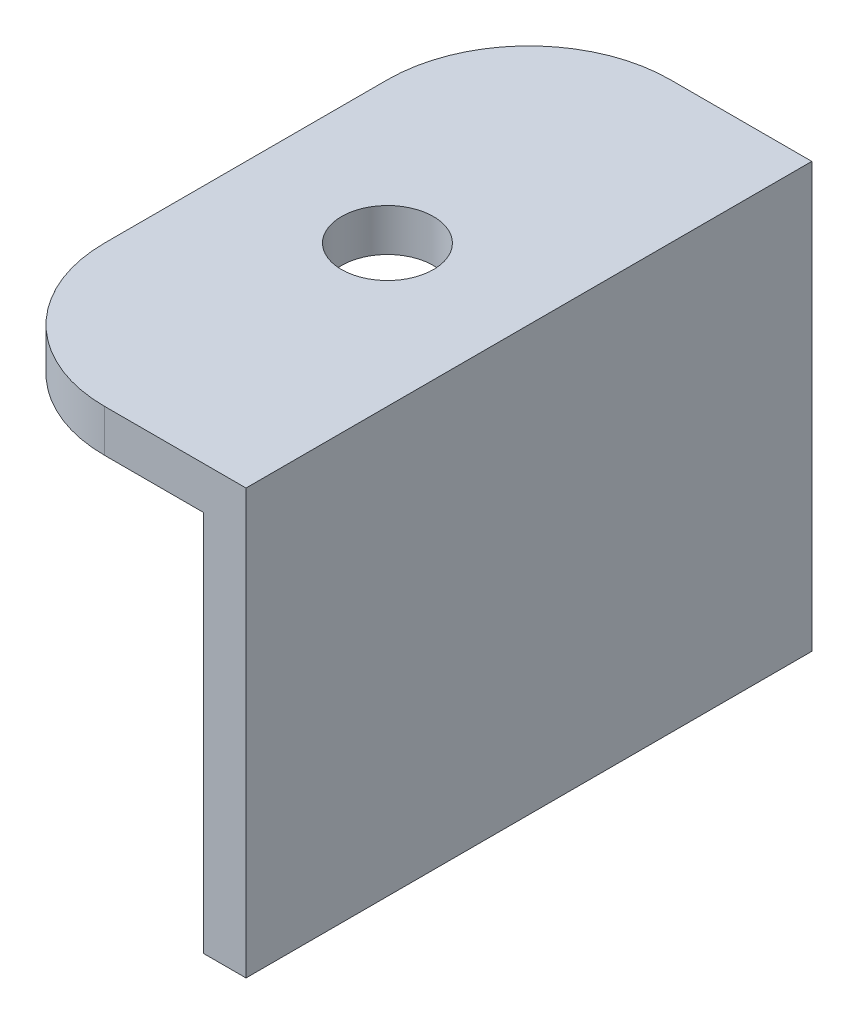
ISO-10303-21;
HEADER;
FILE_DESCRIPTION(('STEP AP214'),'2;1');
FILE_NAME('part.step','',(''),(''),'','','');
FILE_SCHEMA(('AUTOMOTIVE_DESIGN { 1 0 10303 214 1 1 1 1 }'));
ENDSEC;
DATA;
#1=APPLICATION_CONTEXT('core data for automotive mechanical design processes');
#2=APPLICATION_PROTOCOL_DEFINITION('international standard','automotive_design',2000,#1);
#3=PRODUCT_CONTEXT('',#1,'mechanical');
#4=PRODUCT('Part','Part','',(#3));
#5=PRODUCT_RELATED_PRODUCT_CATEGORY('part','',(#4));
#6=PRODUCT_DEFINITION_FORMATION('','',#4);
#7=PRODUCT_DEFINITION_CONTEXT('part definition',#1,'design');
#8=PRODUCT_DEFINITION('design','',#6,#7);
#9=PRODUCT_DEFINITION_SHAPE('','',#8);
#10=(LENGTH_UNIT() NAMED_UNIT(*) SI_UNIT(.MILLI.,.METRE.));
#11=(NAMED_UNIT(*) PLANE_ANGLE_UNIT() SI_UNIT($,.RADIAN.));
#12=(NAMED_UNIT(*) SI_UNIT($,.STERADIAN.) SOLID_ANGLE_UNIT());
#13=UNCERTAINTY_MEASURE_WITH_UNIT(LENGTH_MEASURE(1.E-05),#10,'distance_accuracy_value','');
#14=(GEOMETRIC_REPRESENTATION_CONTEXT(3) GLOBAL_UNCERTAINTY_ASSIGNED_CONTEXT((#13)) GLOBAL_UNIT_ASSIGNED_CONTEXT((#10,
#11,#12)) REPRESENTATION_CONTEXT('',''));
#15=CARTESIAN_POINT('',(0.,0.,0.));
#16=DIRECTION('',(0.,0.,1.));
#17=DIRECTION('',(1.,0.,0.));
#18=AXIS2_PLACEMENT_3D('',#15,#16,#17);
#19=CARTESIAN_POINT('',(-20.,-3.,-20.));
#20=DIRECTION('',(-1.,0.,0.));
#21=DIRECTION('',(0.,0.,1.));
#22=AXIS2_PLACEMENT_3D('',#19,#20,#21);
#23=PLANE('',#22);
#24=DIRECTION('',(0.,0.,1.));
#25=VECTOR('',#24,1.);
#26=CARTESIAN_POINT('',(-20.,0.,-20.));
#27=LINE('',#26,#25);
#28=CARTESIAN_POINT('',(-20.,0.,-10.));
#29=VERTEX_POINT('',#28);
#30=CARTESIAN_POINT('',(-20.,0.,10.));
#31=VERTEX_POINT('',#30);
#32=EDGE_CURVE('E145',#29,#31,#27,.T.);
#33=ORIENTED_EDGE('',*,*,#32,.F.);
#34=DIRECTION('',(0.,-1.,0.));
#35=VECTOR('',#34,1.);
#36=CARTESIAN_POINT('',(-20.,-3.,-10.));
#37=LINE('',#36,#35);
#38=CARTESIAN_POINT('',(-20.,-3.,-10.));
#39=VERTEX_POINT('',#38);
#40=EDGE_CURVE('E159',#29,#39,#37,.T.);
#41=ORIENTED_EDGE('',*,*,#40,.T.);
#42=DIRECTION('',(0.,0.,1.));
#43=VECTOR('',#42,1.);
#44=CARTESIAN_POINT('',(-20.,-3.,-20.));
#45=LINE('',#44,#43);
#46=CARTESIAN_POINT('',(-20.,-3.,10.));
#47=VERTEX_POINT('',#46);
#48=EDGE_CURVE('E121',#39,#47,#45,.T.);
#49=ORIENTED_EDGE('',*,*,#48,.T.);
#50=DIRECTION('',(0.,-1.,0.));
#51=VECTOR('',#50,1.);
#52=CARTESIAN_POINT('',(-20.,0.,10.));
#53=LINE('',#52,#51);
#54=EDGE_CURVE('E147',#47,#31,#53,.F.);
#55=ORIENTED_EDGE('',*,*,#54,.T.);
#56=EDGE_LOOP('',(#33,#41,#49,#55));
#57=FACE_BOUND('',#56,.T.);
#58=ADVANCED_FACE('F32',(#57),#23,.T.);
#59=CARTESIAN_POINT('',(-20.,0.,-20.));
#60=DIRECTION('',(0.,1.,0.));
#61=DIRECTION('',(0.,0.,1.));
#62=AXIS2_PLACEMENT_3D('',#59,#60,#61);
#63=PLANE('',#62);
#64=CARTESIAN_POINT('',(-10.,0.,0.));
#65=DIRECTION('',(0.,1.,0.));
#66=DIRECTION('',(0.,0.,1.));
#67=AXIS2_PLACEMENT_3D('',#64,#65,#66);
#68=CIRCLE('',#67,3.25);
#69=CARTESIAN_POINT('',(-10.,0.,3.25));
#70=VERTEX_POINT('',#69);
#71=EDGE_CURVE('E157',#70,#70,#68,.T.);
#72=ORIENTED_EDGE('',*,*,#71,.F.);
#73=EDGE_LOOP('',(#72));
#74=FACE_BOUND('',#73,.T.);
#75=DIRECTION('',(-1.,0.,0.));
#76=VECTOR('',#75,1.);
#77=CARTESIAN_POINT('',(-20.,0.,-20.));
#78=LINE('',#77,#76);
#79=CARTESIAN_POINT('',(0.,0.,-20.));
#80=VERTEX_POINT('',#79);
#81=CARTESIAN_POINT('',(-10.,0.,-20.));
#82=VERTEX_POINT('',#81);
#83=EDGE_CURVE('E143',#80,#82,#78,.T.);
#84=ORIENTED_EDGE('',*,*,#83,.T.);
#85=CARTESIAN_POINT('',(-10.,0.,-10.));
#86=DIRECTION('',(0.,1.,0.));
#87=DIRECTION('',(0.,0.,1.));
#88=AXIS2_PLACEMENT_3D('',#85,#86,#87);
#89=CIRCLE('',#88,10.);
#90=EDGE_CURVE('E40',#82,#29,#89,.T.);
#91=ORIENTED_EDGE('',*,*,#90,.T.);
#92=ORIENTED_EDGE('',*,*,#32,.T.);
#93=CARTESIAN_POINT('',(-10.,0.,10.));
#94=DIRECTION('',(0.,1.,0.));
#95=DIRECTION('',(0.,0.,1.));
#96=AXIS2_PLACEMENT_3D('',#93,#94,#95);
#97=CIRCLE('',#96,10.);
#98=CARTESIAN_POINT('',(-10.,0.,20.));
#99=VERTEX_POINT('',#98);
#100=EDGE_CURVE('E47',#31,#99,#97,.T.);
#101=ORIENTED_EDGE('',*,*,#100,.T.);
#102=DIRECTION('',(-1.,0.,0.));
#103=VECTOR('',#102,1.);
#104=CARTESIAN_POINT('',(-20.,0.,20.));
#105=LINE('',#104,#103);
#106=CARTESIAN_POINT('',(0.,0.,20.));
#107=VERTEX_POINT('',#106);
#108=EDGE_CURVE('E132',#107,#99,#105,.T.);
#109=ORIENTED_EDGE('',*,*,#108,.F.);
#110=DIRECTION('',(0.,0.,1.));
#111=VECTOR('',#110,1.);
#112=CARTESIAN_POINT('',(0.,0.,-20.));
#113=LINE('',#112,#111);
#114=EDGE_CURVE('E148',#80,#107,#113,.T.);
#115=ORIENTED_EDGE('',*,*,#114,.F.);
#116=EDGE_LOOP('',(#84,#91,#92,#101,#109,#115));
#117=FACE_BOUND('',#116,.T.);
#118=ADVANCED_FACE('F169',(#74,#117),#63,.T.);
#119=CARTESIAN_POINT('',(0.,0.,-20.));
#120=DIRECTION('',(1.,0.,0.));
#121=DIRECTION('',(0.,1.,0.));
#122=AXIS2_PLACEMENT_3D('',#119,#120,#121);
#123=PLANE('',#122);
#124=ORIENTED_EDGE('',*,*,#114,.T.);
#125=DIRECTION('',(0.,1.,0.));
#126=VECTOR('',#125,1.);
#127=CARTESIAN_POINT('',(0.,0.,20.));
#128=LINE('',#127,#126);
#129=CARTESIAN_POINT('',(0.,-30.,20.));
#130=VERTEX_POINT('',#129);
#131=EDGE_CURVE('E126',#130,#107,#128,.T.);
#132=ORIENTED_EDGE('',*,*,#131,.F.);
#133=DIRECTION('',(0.,0.,1.));
#134=VECTOR('',#133,1.);
#135=CARTESIAN_POINT('',(0.,-30.,-20.));
#136=LINE('',#135,#134);
#137=CARTESIAN_POINT('',(0.,-30.,-20.));
#138=VERTEX_POINT('',#137);
#139=EDGE_CURVE('E150',#138,#130,#136,.T.);
#140=ORIENTED_EDGE('',*,*,#139,.F.);
#141=DIRECTION('',(0.,1.,0.));
#142=VECTOR('',#141,1.);
#143=CARTESIAN_POINT('',(0.,0.,-20.));
#144=LINE('',#143,#142);
#145=EDGE_CURVE('E140',#138,#80,#144,.T.);
#146=ORIENTED_EDGE('',*,*,#145,.T.);
#147=EDGE_LOOP('',(#124,#132,#140,#146));
#148=FACE_BOUND('',#147,.T.);
#149=ADVANCED_FACE('F182',(#148),#123,.T.);
#150=CARTESIAN_POINT('',(0.,-30.,-20.));
#151=DIRECTION('',(0.,-1.,0.));
#152=DIRECTION('',(0.,0.,-1.));
#153=AXIS2_PLACEMENT_3D('',#150,#151,#152);
#154=PLANE('',#153);
#155=ORIENTED_EDGE('',*,*,#139,.T.);
#156=DIRECTION('',(1.,0.,0.));
#157=VECTOR('',#156,1.);
#158=CARTESIAN_POINT('',(0.,-30.,20.));
#159=LINE('',#158,#157);
#160=CARTESIAN_POINT('',(-3.,-30.,20.));
#161=VERTEX_POINT('',#160);
#162=EDGE_CURVE('E124',#161,#130,#159,.T.);
#163=ORIENTED_EDGE('',*,*,#162,.F.);
#164=DIRECTION('',(0.,0.,1.));
#165=VECTOR('',#164,1.);
#166=CARTESIAN_POINT('',(-3.,-30.,-20.));
#167=LINE('',#166,#165);
#168=CARTESIAN_POINT('',(-3.,-30.,-20.));
#169=VERTEX_POINT('',#168);
#170=EDGE_CURVE('E120',#169,#161,#167,.T.);
#171=ORIENTED_EDGE('',*,*,#170,.F.);
#172=DIRECTION('',(1.,0.,0.));
#173=VECTOR('',#172,1.);
#174=CARTESIAN_POINT('',(0.,-30.,-20.));
#175=LINE('',#174,#173);
#176=EDGE_CURVE('E137',#169,#138,#175,.T.);
#177=ORIENTED_EDGE('',*,*,#176,.T.);
#178=EDGE_LOOP('',(#155,#163,#171,#177));
#179=FACE_BOUND('',#178,.T.);
#180=ADVANCED_FACE('F179',(#179),#154,.T.);
#181=CARTESIAN_POINT('',(-3.,-30.,-20.));
#182=DIRECTION('',(-1.,0.,0.));
#183=DIRECTION('',(0.,0.,1.));
#184=AXIS2_PLACEMENT_3D('',#181,#182,#183);
#185=PLANE('',#184);
#186=ORIENTED_EDGE('',*,*,#170,.T.);
#187=DIRECTION('',(0.,-1.,0.));
#188=VECTOR('',#187,1.);
#189=CARTESIAN_POINT('',(-3.,-30.,20.));
#190=LINE('',#189,#188);
#191=CARTESIAN_POINT('',(-3.,-2.99999999999999,20.));
#192=VERTEX_POINT('',#191);
#193=EDGE_CURVE('E106',#192,#161,#190,.T.);
#194=ORIENTED_EDGE('',*,*,#193,.F.);
#195=DIRECTION('',(0.,0.,1.));
#196=VECTOR('',#195,1.);
#197=CARTESIAN_POINT('',(-3.,-2.99999999999999,-20.));
#198=LINE('',#197,#196);
#199=CARTESIAN_POINT('',(-3.,-2.99999999999999,-20.));
#200=VERTEX_POINT('',#199);
#201=EDGE_CURVE('E113',#200,#192,#198,.T.);
#202=ORIENTED_EDGE('',*,*,#201,.F.);
#203=DIRECTION('',(0.,-1.,0.));
#204=VECTOR('',#203,1.);
#205=CARTESIAN_POINT('',(-3.,-30.,-20.));
#206=LINE('',#205,#204);
#207=EDGE_CURVE('E135',#200,#169,#206,.T.);
#208=ORIENTED_EDGE('',*,*,#207,.T.);
#209=EDGE_LOOP('',(#186,#194,#202,#208));
#210=FACE_BOUND('',#209,.T.);
#211=ADVANCED_FACE('F123',(#210),#185,.T.);
#212=CARTESIAN_POINT('',(-3.,-2.99999999999999,-20.));
#213=DIRECTION('',(0.,-1.,0.));
#214=DIRECTION('',(1.,0.,0.));
#215=AXIS2_PLACEMENT_3D('',#212,#213,#214);
#216=PLANE('',#215);
#217=CARTESIAN_POINT('',(-10.,-3.,0.));
#218=DIRECTION('',(0.,-1.,0.));
#219=DIRECTION('',(1.,0.,0.));
#220=AXIS2_PLACEMENT_3D('',#217,#218,#219);
#221=CIRCLE('',#220,3.25);
#222=CARTESIAN_POINT('',(-6.75,-2.99999999999999,0.));
#223=VERTEX_POINT('',#222);
#224=EDGE_CURVE('E110',#223,#223,#221,.T.);
#225=ORIENTED_EDGE('',*,*,#224,.F.);
#226=EDGE_LOOP('',(#225));
#227=FACE_BOUND('',#226,.T.);
#228=ORIENTED_EDGE('',*,*,#48,.F.);
#229=CARTESIAN_POINT('',(-10.,-3.,-10.));
#230=DIRECTION('',(0.,-1.,0.));
#231=DIRECTION('',(1.,0.,0.));
#232=AXIS2_PLACEMENT_3D('',#229,#230,#231);
#233=CIRCLE('',#232,10.);
#234=CARTESIAN_POINT('',(-10.,-3.,-20.));
#235=VERTEX_POINT('',#234);
#236=EDGE_CURVE('E164',#39,#235,#233,.T.);
#237=ORIENTED_EDGE('',*,*,#236,.T.);
#238=DIRECTION('',(1.,0.,0.));
#239=VECTOR('',#238,1.);
#240=CARTESIAN_POINT('',(-3.,-2.99999999999999,-20.));
#241=LINE('',#240,#239);
#242=EDGE_CURVE('E116',#235,#200,#241,.T.);
#243=ORIENTED_EDGE('',*,*,#242,.T.);
#244=ORIENTED_EDGE('',*,*,#201,.T.);
#245=DIRECTION('',(1.,0.,0.));
#246=VECTOR('',#245,1.);
#247=CARTESIAN_POINT('',(-3.,-2.99999999999999,20.));
#248=LINE('',#247,#246);
#249=CARTESIAN_POINT('',(-10.,-3.,20.));
#250=VERTEX_POINT('',#249);
#251=EDGE_CURVE('E101',#250,#192,#248,.T.);
#252=ORIENTED_EDGE('',*,*,#251,.F.);
#253=CARTESIAN_POINT('',(-10.,-3.,10.));
#254=DIRECTION('',(0.,-1.,0.));
#255=DIRECTION('',(1.,0.,0.));
#256=AXIS2_PLACEMENT_3D('',#253,#254,#255);
#257=CIRCLE('',#256,10.);
#258=EDGE_CURVE('E162',#250,#47,#257,.T.);
#259=ORIENTED_EDGE('',*,*,#258,.T.);
#260=EDGE_LOOP('',(#228,#237,#243,#244,#252,#259));
#261=FACE_BOUND('',#260,.T.);
#262=ADVANCED_FACE('F115',(#227,#261),#216,.T.);
#263=CARTESIAN_POINT('',(0.,0.,-20.));
#264=DIRECTION('',(0.,0.,-1.));
#265=DIRECTION('',(-1.,0.,0.));
#266=AXIS2_PLACEMENT_3D('',#263,#264,#265);
#267=PLANE('',#266);
#268=ORIENTED_EDGE('',*,*,#242,.F.);
#269=DIRECTION('',(0.,-1.,0.));
#270=VECTOR('',#269,1.);
#271=CARTESIAN_POINT('',(-10.,0.,-20.));
#272=LINE('',#271,#270);
#273=EDGE_CURVE('E55',#235,#82,#272,.F.);
#274=ORIENTED_EDGE('',*,*,#273,.T.);
#275=ORIENTED_EDGE('',*,*,#83,.F.);
#276=ORIENTED_EDGE('',*,*,#145,.F.);
#277=ORIENTED_EDGE('',*,*,#176,.F.);
#278=ORIENTED_EDGE('',*,*,#207,.F.);
#279=EDGE_LOOP('',(#268,#274,#275,#276,#277,#278));
#280=FACE_BOUND('',#279,.T.);
#281=ADVANCED_FACE('F175',(#280),#267,.T.);
#282=CARTESIAN_POINT('',(0.,0.,20.));
#283=DIRECTION('',(0.,0.,-1.));
#284=DIRECTION('',(-1.,0.,0.));
#285=AXIS2_PLACEMENT_3D('',#282,#283,#284);
#286=PLANE('',#285);
#287=ORIENTED_EDGE('',*,*,#108,.T.);
#288=DIRECTION('',(0.,-1.,0.));
#289=VECTOR('',#288,1.);
#290=CARTESIAN_POINT('',(-10.,-3.,20.));
#291=LINE('',#290,#289);
#292=EDGE_CURVE('E11',#99,#250,#291,.T.);
#293=ORIENTED_EDGE('',*,*,#292,.T.);
#294=ORIENTED_EDGE('',*,*,#251,.T.);
#295=ORIENTED_EDGE('',*,*,#193,.T.);
#296=ORIENTED_EDGE('',*,*,#162,.T.);
#297=ORIENTED_EDGE('',*,*,#131,.T.);
#298=EDGE_LOOP('',(#287,#293,#294,#295,#296,#297));
#299=FACE_BOUND('',#298,.T.);
#300=ADVANCED_FACE('F103',(#299),#286,.F.);
#301=CARTESIAN_POINT('',(-10.,-40.,0.));
#302=DIRECTION('',(0.,1.,0.));
#303=DIRECTION('',(0.,0.,1.));
#304=AXIS2_PLACEMENT_3D('',#301,#302,#303);
#305=CYLINDRICAL_SURFACE('',#304,3.25);
#306=ORIENTED_EDGE('',*,*,#224,.T.);
#307=EDGE_LOOP('',(#306));
#308=FACE_BOUND('',#307,.T.);
#309=ORIENTED_EDGE('',*,*,#71,.T.);
#310=EDGE_LOOP('',(#309));
#311=FACE_BOUND('',#310,.T.);
#312=ADVANCED_FACE('F188',(#308,#311),#305,.F.);
#313=CARTESIAN_POINT('',(-10.,-3.,-10.));
#314=DIRECTION('',(0.,-1.,0.));
#315=DIRECTION('',(0.,0.,-1.));
#316=AXIS2_PLACEMENT_3D('',#313,#314,#315);
#317=CYLINDRICAL_SURFACE('',#316,10.);
#318=ORIENTED_EDGE('',*,*,#90,.F.);
#319=ORIENTED_EDGE('',*,*,#273,.F.);
#320=ORIENTED_EDGE('',*,*,#236,.F.);
#321=ORIENTED_EDGE('',*,*,#40,.F.);
#322=EDGE_LOOP('',(#318,#319,#320,#321));
#323=FACE_BOUND('',#322,.T.);
#324=ADVANCED_FACE('F174',(#323),#317,.T.);
#325=CARTESIAN_POINT('',(-10.,0.,10.));
#326=DIRECTION('',(0.,1.,0.));
#327=DIRECTION('',(0.,0.,1.));
#328=AXIS2_PLACEMENT_3D('',#325,#326,#327);
#329=CYLINDRICAL_SURFACE('',#328,10.);
#330=ORIENTED_EDGE('',*,*,#100,.F.);
#331=ORIENTED_EDGE('',*,*,#54,.F.);
#332=ORIENTED_EDGE('',*,*,#258,.F.);
#333=ORIENTED_EDGE('',*,*,#292,.F.);
#334=EDGE_LOOP('',(#330,#331,#332,#333));
#335=FACE_BOUND('',#334,.T.);
#336=ADVANCED_FACE('F34',(#335),#329,.T.);
#337=CLOSED_SHELL('',(#58,#118,#149,#180,#211,#262,#281,#300,#312,#324,#336));
#338=MANIFOLD_SOLID_BREP('B2',#337);
#339=ADVANCED_BREP_SHAPE_REPRESENTATION('',(#18,#338),#14);
#340=SHAPE_DEFINITION_REPRESENTATION(#9,#339);
ENDSEC;
END-ISO-10303-21;
